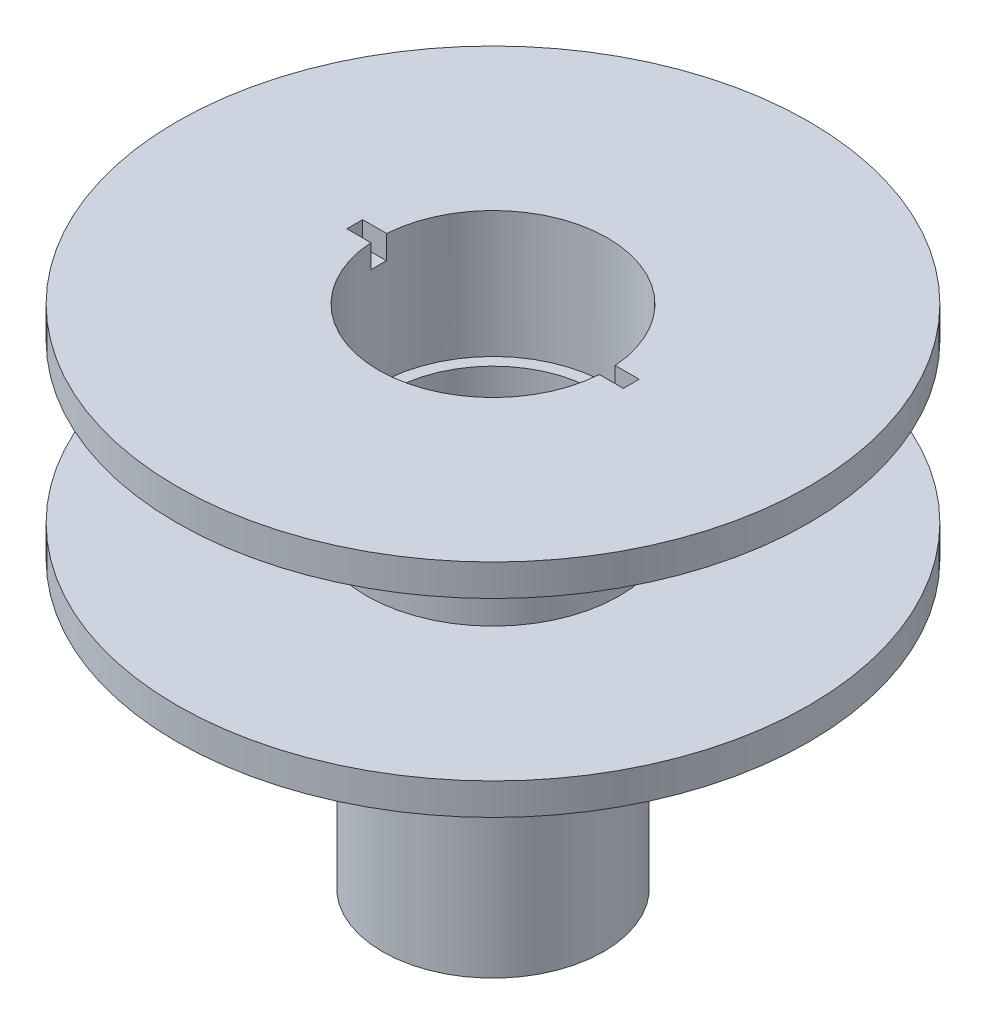
ISO-10303-21;
HEADER;
FILE_DESCRIPTION(('STEP AP214'),'2;1');
FILE_NAME('part.step','',(''),(''),'','','');
FILE_SCHEMA(('AUTOMOTIVE_DESIGN { 1 0 10303 214 1 1 1 1 }'));
ENDSEC;
DATA;
#1=APPLICATION_CONTEXT('core data for automotive mechanical design processes');
#2=APPLICATION_PROTOCOL_DEFINITION('international standard','automotive_design',2000,#1);
#3=PRODUCT_CONTEXT('',#1,'mechanical');
#4=PRODUCT('Part','Part','',(#3));
#5=PRODUCT_RELATED_PRODUCT_CATEGORY('part','',(#4));
#6=PRODUCT_DEFINITION_FORMATION('','',#4);
#7=PRODUCT_DEFINITION_CONTEXT('part definition',#1,'design');
#8=PRODUCT_DEFINITION('design','',#6,#7);
#9=PRODUCT_DEFINITION_SHAPE('','',#8);
#10=(LENGTH_UNIT() NAMED_UNIT(*) SI_UNIT(.MILLI.,.METRE.));
#11=(NAMED_UNIT(*) PLANE_ANGLE_UNIT() SI_UNIT($,.RADIAN.));
#12=(NAMED_UNIT(*) SI_UNIT($,.STERADIAN.) SOLID_ANGLE_UNIT());
#13=UNCERTAINTY_MEASURE_WITH_UNIT(LENGTH_MEASURE(1.E-05),#10,'distance_accuracy_value','');
#14=(GEOMETRIC_REPRESENTATION_CONTEXT(3) GLOBAL_UNCERTAINTY_ASSIGNED_CONTEXT((#13)) GLOBAL_UNIT_ASSIGNED_CONTEXT((#10,
#11,#12)) REPRESENTATION_CONTEXT('',''));
#15=CARTESIAN_POINT('',(0.,0.,0.));
#16=DIRECTION('',(0.,0.,1.));
#17=DIRECTION('',(1.,0.,0.));
#18=AXIS2_PLACEMENT_3D('',#15,#16,#17);
#19=CARTESIAN_POINT('',(0.,-0.626106049824934,40.));
#20=DIRECTION('',(0.,-1.,0.));
#21=DIRECTION('',(0.,0.,-1.));
#22=AXIS2_PLACEMENT_3D('',#19,#20,#21);
#23=PLANE('',#22);
#24=CARTESIAN_POINT('',(0.,-0.626106049824934,0.));
#25=DIRECTION('',(0.,1.,0.));
#26=DIRECTION('',(0.,0.,1.));
#27=AXIS2_PLACEMENT_3D('',#24,#25,#26);
#28=CIRCLE('',#27,14.);
#29=CARTESIAN_POINT('',(0.,-0.626106049824934,14.));
#30=VERTEX_POINT('',#29);
#31=EDGE_CURVE('E183',#30,#30,#28,.T.);
#32=ORIENTED_EDGE('',*,*,#31,.T.);
#33=EDGE_LOOP('',(#32));
#34=FACE_BOUND('',#33,.T.);
#35=CARTESIAN_POINT('',(0.,-0.626106049824934,0.));
#36=DIRECTION('',(0.,1.,0.));
#37=DIRECTION('',(0.,0.,1.));
#38=AXIS2_PLACEMENT_3D('',#35,#36,#37);
#39=CIRCLE('',#38,40.);
#40=CARTESIAN_POINT('',(0.,-0.626106049824934,40.));
#41=VERTEX_POINT('',#40);
#42=EDGE_CURVE('E215',#41,#41,#39,.T.);
#43=ORIENTED_EDGE('',*,*,#42,.F.);
#44=EDGE_LOOP('',(#43));
#45=FACE_BOUND('',#44,.T.);
#46=ADVANCED_FACE('F38',(#34,#45),#23,.T.);
#47=CARTESIAN_POINT('',(0.,28.0586262240942,0.));
#48=DIRECTION('',(0.,1.,0.));
#49=DIRECTION('',(0.,0.,1.));
#50=AXIS2_PLACEMENT_3D('',#47,#48,#49);
#51=CYLINDRICAL_SURFACE('',#50,40.);
#52=ORIENTED_EDGE('',*,*,#42,.T.);
#53=EDGE_LOOP('',(#52));
#54=FACE_BOUND('',#53,.T.);
#55=CARTESIAN_POINT('',(0.,3.37389395017507,0.));
#56=DIRECTION('',(0.,1.,0.));
#57=DIRECTION('',(0.,0.,1.));
#58=AXIS2_PLACEMENT_3D('',#55,#56,#57);
#59=CIRCLE('',#58,40.);
#60=CARTESIAN_POINT('',(0.,3.37389395017507,40.));
#61=VERTEX_POINT('',#60);
#62=EDGE_CURVE('E211',#61,#61,#59,.T.);
#63=ORIENTED_EDGE('',*,*,#62,.F.);
#64=EDGE_LOOP('',(#63));
#65=FACE_BOUND('',#64,.T.);
#66=ADVANCED_FACE('F266',(#54,#65),#51,.T.);
#67=CARTESIAN_POINT('',(0.,3.37389395017507,16.));
#68=DIRECTION('',(0.,1.,0.));
#69=DIRECTION('',(0.,0.,1.));
#70=AXIS2_PLACEMENT_3D('',#67,#68,#69);
#71=PLANE('',#70);
#72=ORIENTED_EDGE('',*,*,#62,.T.);
#73=EDGE_LOOP('',(#72));
#74=FACE_BOUND('',#73,.T.);
#75=CARTESIAN_POINT('',(0.,3.37389395017507,0.));
#76=DIRECTION('',(0.,1.,0.));
#77=DIRECTION('',(0.,0.,1.));
#78=AXIS2_PLACEMENT_3D('',#75,#76,#77);
#79=CIRCLE('',#78,16.);
#80=CARTESIAN_POINT('',(0.,3.37389395017507,16.));
#81=VERTEX_POINT('',#80);
#82=EDGE_CURVE('E207',#81,#81,#79,.T.);
#83=ORIENTED_EDGE('',*,*,#82,.F.);
#84=EDGE_LOOP('',(#83));
#85=FACE_BOUND('',#84,.T.);
#86=ADVANCED_FACE('F271',(#74,#85),#71,.T.);
#87=CARTESIAN_POINT('',(0.,28.0586262240942,0.));
#88=DIRECTION('',(0.,1.,0.));
#89=DIRECTION('',(0.,0.,1.));
#90=AXIS2_PLACEMENT_3D('',#87,#88,#89);
#91=CYLINDRICAL_SURFACE('',#90,16.);
#92=ORIENTED_EDGE('',*,*,#82,.T.);
#93=EDGE_LOOP('',(#92));
#94=FACE_BOUND('',#93,.T.);
#95=CARTESIAN_POINT('',(0.,23.3738939501751,0.));
#96=DIRECTION('',(0.,1.,0.));
#97=DIRECTION('',(0.,0.,1.));
#98=AXIS2_PLACEMENT_3D('',#95,#96,#97);
#99=CIRCLE('',#98,16.);
#100=CARTESIAN_POINT('',(0.,23.3738939501751,16.));
#101=VERTEX_POINT('',#100);
#102=EDGE_CURVE('E203',#101,#101,#99,.T.);
#103=ORIENTED_EDGE('',*,*,#102,.F.);
#104=EDGE_LOOP('',(#103));
#105=FACE_BOUND('',#104,.T.);
#106=ADVANCED_FACE('F281',(#94,#105),#91,.T.);
#107=CARTESIAN_POINT('',(0.,28.0586262240942,0.));
#108=DIRECTION('',(0.,1.,0.));
#109=DIRECTION('',(0.,0.,1.));
#110=AXIS2_PLACEMENT_3D('',#107,#108,#109);
#111=CYLINDRICAL_SURFACE('',#110,14.5);
#112=DIRECTION('',(0.,1.,0.));
#113=VECTOR('',#112,1.);
#114=CARTESIAN_POINT('',(14.4654761414894,28.0586262240942,-1.));
#115=LINE('',#114,#113);
#116=CARTESIAN_POINT('',(14.4654761414894,27.3738939501751,-1.));
#117=VERTEX_POINT('',#116);
#118=CARTESIAN_POINT('',(14.4654761414894,24.3738939501751,-1.));
#119=VERTEX_POINT('',#118);
#120=EDGE_CURVE('E164',#117,#119,#115,.F.);
#121=ORIENTED_EDGE('',*,*,#120,.F.);
#122=CARTESIAN_POINT('',(0.,27.3738939501751,0.));
#123=DIRECTION('',(0.,1.,0.));
#124=DIRECTION('',(0.,0.,1.));
#125=AXIS2_PLACEMENT_3D('',#122,#123,#124);
#126=CIRCLE('',#125,14.5);
#127=CARTESIAN_POINT('',(-14.4654761414894,27.3738939501751,-0.999999999999998));
#128=VERTEX_POINT('',#127);
#129=EDGE_CURVE('E174',#128,#117,#126,.F.);
#130=ORIENTED_EDGE('',*,*,#129,.F.);
#131=DIRECTION('',(0.,1.,0.));
#132=VECTOR('',#131,1.);
#133=CARTESIAN_POINT('',(-14.4654761414894,28.0586262240942,-0.999999999999998));
#134=LINE('',#133,#132);
#135=CARTESIAN_POINT('',(-14.4654761414894,24.3738939501751,-0.999999999999998));
#136=VERTEX_POINT('',#135);
#137=EDGE_CURVE('E167',#136,#128,#134,.T.);
#138=ORIENTED_EDGE('',*,*,#137,.F.);
#139=CARTESIAN_POINT('',(0.,24.3738939501751,0.));
#140=DIRECTION('',(0.,1.,0.));
#141=DIRECTION('',(0.,0.,1.));
#142=AXIS2_PLACEMENT_3D('',#139,#140,#141);
#143=CIRCLE('',#142,14.5);
#144=CARTESIAN_POINT('',(-14.4654761414894,24.3738939501751,1.));
#145=VERTEX_POINT('',#144);
#146=EDGE_CURVE('E41',#136,#145,#143,.T.);
#147=ORIENTED_EDGE('',*,*,#146,.T.);
#148=DIRECTION('',(0.,1.,0.));
#149=VECTOR('',#148,1.);
#150=CARTESIAN_POINT('',(-14.4654761414894,28.0586262240942,1.));
#151=LINE('',#150,#149);
#152=CARTESIAN_POINT('',(-14.4654761414894,27.3738939501751,1.));
#153=VERTEX_POINT('',#152);
#154=EDGE_CURVE('E118',#153,#145,#151,.F.);
#155=ORIENTED_EDGE('',*,*,#154,.F.);
#156=CARTESIAN_POINT('',(14.4654761414894,27.3738939501751,0.999999999999999));
#157=VERTEX_POINT('',#156);
#158=EDGE_CURVE('E170',#157,#153,#126,.F.);
#159=ORIENTED_EDGE('',*,*,#158,.F.);
#160=DIRECTION('',(0.,1.,0.));
#161=VECTOR('',#160,1.);
#162=CARTESIAN_POINT('',(14.4654761414894,28.0586262240942,0.999999999999998));
#163=LINE('',#162,#161);
#164=CARTESIAN_POINT('',(14.4654761414894,24.3738939501751,0.999999999999998));
#165=VERTEX_POINT('',#164);
#166=EDGE_CURVE('E61',#165,#157,#163,.T.);
#167=ORIENTED_EDGE('',*,*,#166,.F.);
#168=EDGE_CURVE('E11',#165,#119,#143,.T.);
#169=ORIENTED_EDGE('',*,*,#168,.T.);
#170=EDGE_LOOP('',(#121,#130,#138,#147,#155,#159,#167,#169));
#171=FACE_BOUND('',#170,.T.);
#172=CARTESIAN_POINT('',(0.,11.3738939501751,0.));
#173=DIRECTION('',(0.,1.,0.));
#174=DIRECTION('',(0.,0.,1.));
#175=AXIS2_PLACEMENT_3D('',#172,#173,#174);
#176=CIRCLE('',#175,14.5);
#177=CARTESIAN_POINT('',(0.,11.3738939501751,14.5));
#178=VERTEX_POINT('',#177);
#179=EDGE_CURVE('E199',#178,#178,#176,.T.);
#180=ORIENTED_EDGE('',*,*,#179,.F.);
#181=EDGE_LOOP('',(#180));
#182=FACE_BOUND('',#181,.T.);
#183=ADVANCED_FACE('F229',(#171,#182),#111,.F.);
#184=CARTESIAN_POINT('',(0.,11.3738939501751,13.));
#185=DIRECTION('',(0.,1.,0.));
#186=DIRECTION('',(0.,0.,1.));
#187=AXIS2_PLACEMENT_3D('',#184,#185,#186);
#188=PLANE('',#187);
#189=ORIENTED_EDGE('',*,*,#179,.T.);
#190=EDGE_LOOP('',(#189));
#191=FACE_BOUND('',#190,.T.);
#192=CARTESIAN_POINT('',(0.,11.3738939501751,0.));
#193=DIRECTION('',(0.,1.,0.));
#194=DIRECTION('',(0.,0.,1.));
#195=AXIS2_PLACEMENT_3D('',#192,#193,#194);
#196=CIRCLE('',#195,13.);
#197=CARTESIAN_POINT('',(0.,11.3738939501751,13.));
#198=VERTEX_POINT('',#197);
#199=EDGE_CURVE('E195',#198,#198,#196,.T.);
#200=ORIENTED_EDGE('',*,*,#199,.F.);
#201=EDGE_LOOP('',(#200));
#202=FACE_BOUND('',#201,.T.);
#203=ADVANCED_FACE('F294',(#191,#202),#188,.T.);
#204=CARTESIAN_POINT('',(0.,28.0586262240942,0.));
#205=DIRECTION('',(0.,1.,0.));
#206=DIRECTION('',(0.,0.,1.));
#207=AXIS2_PLACEMENT_3D('',#204,#205,#206);
#208=CYLINDRICAL_SURFACE('',#207,13.);
#209=ORIENTED_EDGE('',*,*,#199,.T.);
#210=EDGE_LOOP('',(#209));
#211=FACE_BOUND('',#210,.T.);
#212=CARTESIAN_POINT('',(0.,-36.6261060498249,0.));
#213=DIRECTION('',(0.,1.,0.));
#214=DIRECTION('',(0.,0.,1.));
#215=AXIS2_PLACEMENT_3D('',#212,#213,#214);
#216=CIRCLE('',#215,13.);
#217=CARTESIAN_POINT('',(0.,-36.6261060498249,13.));
#218=VERTEX_POINT('',#217);
#219=EDGE_CURVE('E191',#218,#218,#216,.T.);
#220=ORIENTED_EDGE('',*,*,#219,.F.);
#221=EDGE_LOOP('',(#220));
#222=FACE_BOUND('',#221,.T.);
#223=ADVANCED_FACE('F299',(#211,#222),#208,.F.);
#224=CARTESIAN_POINT('',(0.,-36.6261060498249,14.));
#225=DIRECTION('',(0.,-1.,0.));
#226=DIRECTION('',(0.,0.,-1.));
#227=AXIS2_PLACEMENT_3D('',#224,#225,#226);
#228=PLANE('',#227);
#229=ORIENTED_EDGE('',*,*,#219,.T.);
#230=EDGE_LOOP('',(#229));
#231=FACE_BOUND('',#230,.T.);
#232=CARTESIAN_POINT('',(0.,-36.6261060498249,0.));
#233=DIRECTION('',(0.,1.,0.));
#234=DIRECTION('',(0.,0.,1.));
#235=AXIS2_PLACEMENT_3D('',#232,#233,#234);
#236=CIRCLE('',#235,14.);
#237=CARTESIAN_POINT('',(0.,-36.6261060498249,14.));
#238=VERTEX_POINT('',#237);
#239=EDGE_CURVE('E187',#238,#238,#236,.T.);
#240=ORIENTED_EDGE('',*,*,#239,.F.);
#241=EDGE_LOOP('',(#240));
#242=FACE_BOUND('',#241,.T.);
#243=ADVANCED_FACE('F303',(#231,#242),#228,.T.);
#244=CARTESIAN_POINT('',(0.,28.0586262240942,0.));
#245=DIRECTION('',(0.,1.,0.));
#246=DIRECTION('',(0.,0.,1.));
#247=AXIS2_PLACEMENT_3D('',#244,#245,#246);
#248=CYLINDRICAL_SURFACE('',#247,14.);
#249=ORIENTED_EDGE('',*,*,#239,.T.);
#250=EDGE_LOOP('',(#249));
#251=FACE_BOUND('',#250,.T.);
#252=ORIENTED_EDGE('',*,*,#31,.F.);
#253=EDGE_LOOP('',(#252));
#254=FACE_BOUND('',#253,.T.);
#255=ADVANCED_FACE('F307',(#251,#254),#248,.T.);
#256=CARTESIAN_POINT('',(0.,27.3738939501751,40.));
#257=DIRECTION('',(0.,1.,0.));
#258=DIRECTION('',(0.,0.,-1.));
#259=AXIS2_PLACEMENT_3D('',#256,#257,#258);
#260=PLANE('',#259);
#261=DIRECTION('',(-1.,0.,0.));
#262=VECTOR('',#261,1.);
#263=CARTESIAN_POINT('',(0.,27.3738939501751,-1.));
#264=LINE('',#263,#262);
#265=CARTESIAN_POINT('',(-17.5,27.3738939501751,-0.999999999999998));
#266=VERTEX_POINT('',#265);
#267=EDGE_CURVE('E221',#128,#266,#264,.T.);
#268=ORIENTED_EDGE('',*,*,#267,.F.);
#269=ORIENTED_EDGE('',*,*,#129,.T.);
#270=DIRECTION('',(-1.,0.,0.));
#271=VECTOR('',#270,1.);
#272=CARTESIAN_POINT('',(17.5,27.3738939501751,-1.));
#273=LINE('',#272,#271);
#274=CARTESIAN_POINT('',(17.5,27.3738939501751,-1.));
#275=VERTEX_POINT('',#274);
#276=EDGE_CURVE('E130',#275,#117,#273,.T.);
#277=ORIENTED_EDGE('',*,*,#276,.F.);
#278=DIRECTION('',(0.,0.,-1.));
#279=VECTOR('',#278,1.);
#280=CARTESIAN_POINT('',(17.5,27.3738939501751,0.999999999999998));
#281=LINE('',#280,#279);
#282=CARTESIAN_POINT('',(17.5,27.3738939501751,0.999999999999998));
#283=VERTEX_POINT('',#282);
#284=EDGE_CURVE('E134',#283,#275,#281,.T.);
#285=ORIENTED_EDGE('',*,*,#284,.F.);
#286=DIRECTION('',(1.,0.,0.));
#287=VECTOR('',#286,1.);
#288=CARTESIAN_POINT('',(0.,27.3738939501751,1.));
#289=LINE('',#288,#287);
#290=EDGE_CURVE('E219',#157,#283,#289,.T.);
#291=ORIENTED_EDGE('',*,*,#290,.F.);
#292=ORIENTED_EDGE('',*,*,#158,.T.);
#293=DIRECTION('',(1.,0.,0.));
#294=VECTOR('',#293,1.);
#295=CARTESIAN_POINT('',(17.5,27.3738939501751,0.999999999999998));
#296=LINE('',#295,#294);
#297=CARTESIAN_POINT('',(-17.5,27.3738939501751,1.));
#298=VERTEX_POINT('',#297);
#299=EDGE_CURVE('E145',#298,#153,#296,.T.);
#300=ORIENTED_EDGE('',*,*,#299,.F.);
#301=DIRECTION('',(0.,0.,1.));
#302=VECTOR('',#301,1.);
#303=CARTESIAN_POINT('',(-17.5,27.3738939501751,1.));
#304=LINE('',#303,#302);
#305=EDGE_CURVE('E53',#266,#298,#304,.T.);
#306=ORIENTED_EDGE('',*,*,#305,.F.);
#307=EDGE_LOOP('',(#268,#269,#277,#285,#291,#292,#300,#306));
#308=FACE_BOUND('',#307,.T.);
#309=CARTESIAN_POINT('',(0.,27.3738939501751,0.));
#310=DIRECTION('',(0.,1.,0.));
#311=DIRECTION('',(0.,0.,1.));
#312=AXIS2_PLACEMENT_3D('',#309,#310,#311);
#313=CIRCLE('',#312,40.);
#314=CARTESIAN_POINT('',(0.,27.3738939501751,40.));
#315=VERTEX_POINT('',#314);
#316=EDGE_CURVE('E179',#315,#315,#313,.T.);
#317=ORIENTED_EDGE('',*,*,#316,.T.);
#318=EDGE_LOOP('',(#317));
#319=FACE_BOUND('',#318,.T.);
#320=ADVANCED_FACE('F239',(#308,#319),#260,.T.);
#321=CARTESIAN_POINT('',(0.,-1.3108383237441,0.));
#322=DIRECTION('',(0.,-1.,0.));
#323=DIRECTION('',(0.,0.,1.));
#324=AXIS2_PLACEMENT_3D('',#321,#322,#323);
#325=CYLINDRICAL_SURFACE('',#324,40.);
#326=ORIENTED_EDGE('',*,*,#316,.F.);
#327=EDGE_LOOP('',(#326));
#328=FACE_BOUND('',#327,.T.);
#329=CARTESIAN_POINT('',(0.,23.3738939501751,0.));
#330=DIRECTION('',(0.,1.,0.));
#331=DIRECTION('',(0.,0.,1.));
#332=AXIS2_PLACEMENT_3D('',#329,#330,#331);
#333=CIRCLE('',#332,40.);
#334=CARTESIAN_POINT('',(0.,23.3738939501751,40.));
#335=VERTEX_POINT('',#334);
#336=EDGE_CURVE('E175',#335,#335,#333,.T.);
#337=ORIENTED_EDGE('',*,*,#336,.T.);
#338=EDGE_LOOP('',(#337));
#339=FACE_BOUND('',#338,.T.);
#340=ADVANCED_FACE('F260',(#328,#339),#325,.T.);
#341=CARTESIAN_POINT('',(0.,23.3738939501751,16.));
#342=DIRECTION('',(0.,-1.,0.));
#343=DIRECTION('',(0.,0.,1.));
#344=AXIS2_PLACEMENT_3D('',#341,#342,#343);
#345=PLANE('',#344);
#346=ORIENTED_EDGE('',*,*,#336,.F.);
#347=EDGE_LOOP('',(#346));
#348=FACE_BOUND('',#347,.T.);
#349=ORIENTED_EDGE('',*,*,#102,.T.);
#350=EDGE_LOOP('',(#349));
#351=FACE_BOUND('',#350,.T.);
#352=ADVANCED_FACE('F253',(#348,#351),#345,.T.);
#353=CARTESIAN_POINT('',(17.5,24.3738939501751,0.999999999999998));
#354=DIRECTION('',(0.,0.,1.));
#355=DIRECTION('',(1.,0.,0.));
#356=AXIS2_PLACEMENT_3D('',#353,#354,#355);
#357=PLANE('',#356);
#358=ORIENTED_EDGE('',*,*,#166,.T.);
#359=ORIENTED_EDGE('',*,*,#290,.T.);
#360=DIRECTION('',(0.,1.,0.));
#361=VECTOR('',#360,1.);
#362=CARTESIAN_POINT('',(17.5,24.3738939501751,0.999999999999998));
#363=LINE('',#362,#361);
#364=CARTESIAN_POINT('',(17.5,24.3738939501751,0.999999999999998));
#365=VERTEX_POINT('',#364);
#366=EDGE_CURVE('E111',#365,#283,#363,.T.);
#367=ORIENTED_EDGE('',*,*,#366,.F.);
#368=DIRECTION('',(1.,0.,0.));
#369=VECTOR('',#368,1.);
#370=CARTESIAN_POINT('',(17.5,24.3738939501751,0.999999999999998));
#371=LINE('',#370,#369);
#372=EDGE_CURVE('E123',#165,#365,#371,.T.);
#373=ORIENTED_EDGE('',*,*,#372,.F.);
#374=EDGE_LOOP('',(#358,#359,#367,#373));
#375=FACE_BOUND('',#374,.T.);
#376=ADVANCED_FACE('F251',(#375),#357,.F.);
#377=CARTESIAN_POINT('',(17.5,24.3738939501751,0.999999999999998));
#378=DIRECTION('',(1.,0.,0.));
#379=DIRECTION('',(0.,0.,-1.));
#380=AXIS2_PLACEMENT_3D('',#377,#378,#379);
#381=PLANE('',#380);
#382=ORIENTED_EDGE('',*,*,#284,.T.);
#383=DIRECTION('',(0.,1.,0.));
#384=VECTOR('',#383,1.);
#385=CARTESIAN_POINT('',(17.5,24.3738939501751,-1.));
#386=LINE('',#385,#384);
#387=CARTESIAN_POINT('',(17.5,24.3738939501751,-1.));
#388=VERTEX_POINT('',#387);
#389=EDGE_CURVE('E154',#388,#275,#386,.T.);
#390=ORIENTED_EDGE('',*,*,#389,.F.);
#391=DIRECTION('',(0.,0.,-1.));
#392=VECTOR('',#391,1.);
#393=CARTESIAN_POINT('',(17.5,24.3738939501751,0.999999999999998));
#394=LINE('',#393,#392);
#395=EDGE_CURVE('E122',#365,#388,#394,.T.);
#396=ORIENTED_EDGE('',*,*,#395,.F.);
#397=ORIENTED_EDGE('',*,*,#366,.T.);
#398=EDGE_LOOP('',(#382,#390,#396,#397));
#399=FACE_BOUND('',#398,.T.);
#400=ADVANCED_FACE('F250',(#399),#381,.F.);
#401=CARTESIAN_POINT('',(17.5,24.3738939501751,-1.));
#402=DIRECTION('',(0.,0.,-1.));
#403=DIRECTION('',(-1.,0.,0.));
#404=AXIS2_PLACEMENT_3D('',#401,#402,#403);
#405=PLANE('',#404);
#406=ORIENTED_EDGE('',*,*,#120,.T.);
#407=DIRECTION('',(-1.,0.,0.));
#408=VECTOR('',#407,1.);
#409=CARTESIAN_POINT('',(17.5,24.3738939501751,-1.));
#410=LINE('',#409,#408);
#411=EDGE_CURVE('E112',#388,#119,#410,.T.);
#412=ORIENTED_EDGE('',*,*,#411,.F.);
#413=ORIENTED_EDGE('',*,*,#389,.T.);
#414=ORIENTED_EDGE('',*,*,#276,.T.);
#415=EDGE_LOOP('',(#406,#412,#413,#414));
#416=FACE_BOUND('',#415,.T.);
#417=ADVANCED_FACE('F244',(#416),#405,.F.);
#418=CARTESIAN_POINT('',(0.,24.3738939501751,0.));
#419=DIRECTION('',(0.,1.,0.));
#420=DIRECTION('',(0.,0.,1.));
#421=AXIS2_PLACEMENT_3D('',#418,#419,#420);
#422=PLANE('',#421);
#423=ORIENTED_EDGE('',*,*,#372,.T.);
#424=ORIENTED_EDGE('',*,*,#395,.T.);
#425=ORIENTED_EDGE('',*,*,#411,.T.);
#426=ORIENTED_EDGE('',*,*,#168,.F.);
#427=EDGE_LOOP('',(#423,#424,#425,#426));
#428=FACE_BOUND('',#427,.T.);
#429=ADVANCED_FACE('F246',(#428),#422,.T.);
#430=ORIENTED_EDGE('',*,*,#137,.T.);
#431=ORIENTED_EDGE('',*,*,#267,.T.);
#432=DIRECTION('',(0.,1.,0.));
#433=VECTOR('',#432,1.);
#434=CARTESIAN_POINT('',(-17.5,24.3738939501751,-0.999999999999998));
#435=LINE('',#434,#433);
#436=CARTESIAN_POINT('',(-17.5,24.3738939501751,-0.999999999999998));
#437=VERTEX_POINT('',#436);
#438=EDGE_CURVE('E151',#437,#266,#435,.T.);
#439=ORIENTED_EDGE('',*,*,#438,.F.);
#440=EDGE_CURVE('E127',#136,#437,#410,.T.);
#441=ORIENTED_EDGE('',*,*,#440,.F.);
#442=EDGE_LOOP('',(#430,#431,#439,#441));
#443=FACE_BOUND('',#442,.T.);
#444=ADVANCED_FACE('F233',(#443),#405,.F.);
#445=CARTESIAN_POINT('',(-17.5,24.3738939501751,1.));
#446=DIRECTION('',(-1.,0.,0.));
#447=DIRECTION('',(0.,0.,1.));
#448=AXIS2_PLACEMENT_3D('',#445,#446,#447);
#449=PLANE('',#448);
#450=ORIENTED_EDGE('',*,*,#305,.T.);
#451=DIRECTION('',(0.,1.,0.));
#452=VECTOR('',#451,1.);
#453=CARTESIAN_POINT('',(-17.5,24.3738939501751,1.));
#454=LINE('',#453,#452);
#455=CARTESIAN_POINT('',(-17.5,24.3738939501751,1.));
#456=VERTEX_POINT('',#455);
#457=EDGE_CURVE('E103',#456,#298,#454,.T.);
#458=ORIENTED_EDGE('',*,*,#457,.F.);
#459=DIRECTION('',(0.,0.,1.));
#460=VECTOR('',#459,1.);
#461=CARTESIAN_POINT('',(-17.5,24.3738939501751,1.));
#462=LINE('',#461,#460);
#463=EDGE_CURVE('E107',#437,#456,#462,.T.);
#464=ORIENTED_EDGE('',*,*,#463,.F.);
#465=ORIENTED_EDGE('',*,*,#438,.T.);
#466=EDGE_LOOP('',(#450,#458,#464,#465));
#467=FACE_BOUND('',#466,.T.);
#468=ADVANCED_FACE('F105',(#467),#449,.F.);
#469=ORIENTED_EDGE('',*,*,#154,.T.);
#470=EDGE_CURVE('E115',#456,#145,#371,.T.);
#471=ORIENTED_EDGE('',*,*,#470,.F.);
#472=ORIENTED_EDGE('',*,*,#457,.T.);
#473=ORIENTED_EDGE('',*,*,#299,.T.);
#474=EDGE_LOOP('',(#469,#471,#472,#473));
#475=FACE_BOUND('',#474,.T.);
#476=ADVANCED_FACE('F116',(#475),#357,.F.);
#477=ORIENTED_EDGE('',*,*,#440,.T.);
#478=ORIENTED_EDGE('',*,*,#463,.T.);
#479=ORIENTED_EDGE('',*,*,#470,.T.);
#480=ORIENTED_EDGE('',*,*,#146,.F.);
#481=EDGE_LOOP('',(#477,#478,#479,#480));
#482=FACE_BOUND('',#481,.T.);
#483=ADVANCED_FACE('F125',(#482),#422,.T.);
#484=CLOSED_SHELL('',(#46,#66,#86,#106,#183,#203,#223,#243,#255,#320,#340,#352,#376,#400,#417,
#429,#444,#468,#476,#483));
#485=MANIFOLD_SOLID_BREP('B2',#484);
#486=ADVANCED_BREP_SHAPE_REPRESENTATION('',(#18,#485),#14);
#487=SHAPE_DEFINITION_REPRESENTATION(#9,#486);
ENDSEC;
END-ISO-10303-21;
